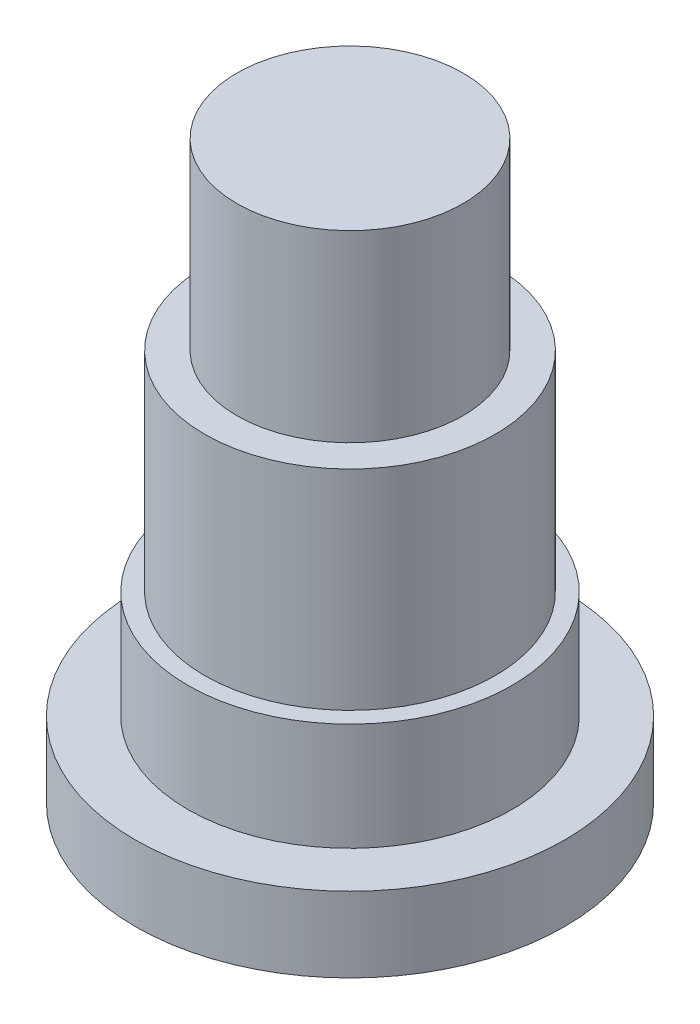
ISO-10303-21;
HEADER;
FILE_DESCRIPTION(('STEP AP214'),'2;1');
FILE_NAME('part.step','',(''),(''),'','','');
FILE_SCHEMA(('AUTOMOTIVE_DESIGN { 1 0 10303 214 1 1 1 1 }'));
ENDSEC;
DATA;
#1=APPLICATION_CONTEXT('core data for automotive mechanical design processes');
#2=APPLICATION_PROTOCOL_DEFINITION('international standard','automotive_design',2000,#1);
#3=PRODUCT_CONTEXT('',#1,'mechanical');
#4=PRODUCT('Part','Part','',(#3));
#5=PRODUCT_RELATED_PRODUCT_CATEGORY('part','',(#4));
#6=PRODUCT_DEFINITION_FORMATION('','',#4);
#7=PRODUCT_DEFINITION_CONTEXT('part definition',#1,'design');
#8=PRODUCT_DEFINITION('design','',#6,#7);
#9=PRODUCT_DEFINITION_SHAPE('','',#8);
#10=(LENGTH_UNIT() NAMED_UNIT(*) SI_UNIT(.MILLI.,.METRE.));
#11=(NAMED_UNIT(*) PLANE_ANGLE_UNIT() SI_UNIT($,.RADIAN.));
#12=(NAMED_UNIT(*) SI_UNIT($,.STERADIAN.) SOLID_ANGLE_UNIT());
#13=UNCERTAINTY_MEASURE_WITH_UNIT(LENGTH_MEASURE(1.E-05),#10,'distance_accuracy_value','');
#14=(GEOMETRIC_REPRESENTATION_CONTEXT(3) GLOBAL_UNCERTAINTY_ASSIGNED_CONTEXT((#13)) GLOBAL_UNIT_ASSIGNED_CONTEXT((#10,
#11,#12)) REPRESENTATION_CONTEXT('',''));
#15=CARTESIAN_POINT('',(0.,0.,0.));
#16=DIRECTION('',(0.,0.,1.));
#17=DIRECTION('',(1.,0.,0.));
#18=AXIS2_PLACEMENT_3D('',#15,#16,#17);
#19=CARTESIAN_POINT('',(0.,0.,0.));
#20=DIRECTION('',(0.,1.,0.));
#21=DIRECTION('',(0.,0.,1.));
#22=AXIS2_PLACEMENT_3D('',#19,#20,#21);
#23=PLANE('',#22);
#24=CARTESIAN_POINT('',(0.,0.,0.));
#25=DIRECTION('',(0.,1.,0.));
#26=DIRECTION('',(0.,0.,1.));
#27=AXIS2_PLACEMENT_3D('',#24,#25,#26);
#28=CIRCLE('',#27,19.865);
#29=CARTESIAN_POINT('',(0.,0.,19.865));
#30=VERTEX_POINT('',#29);
#31=EDGE_CURVE('E10',#30,#30,#28,.T.);
#32=ORIENTED_EDGE('',*,*,#31,.F.);
#33=EDGE_LOOP('',(#32));
#34=FACE_BOUND('',#33,.T.);
#35=ADVANCED_FACE('F37',(#34),#23,.F.);
#36=CARTESIAN_POINT('',(0.,53.24,0.));
#37=DIRECTION('',(0.,1.,0.));
#38=DIRECTION('',(0.,0.,1.));
#39=AXIS2_PLACEMENT_3D('',#36,#37,#38);
#40=CYLINDRICAL_SURFACE('',#39,19.865);
#41=CARTESIAN_POINT('',(0.,6.95,0.));
#42=DIRECTION('',(0.,1.,0.));
#43=DIRECTION('',(0.,0.,1.));
#44=AXIS2_PLACEMENT_3D('',#41,#42,#43);
#45=CIRCLE('',#44,19.865);
#46=CARTESIAN_POINT('',(0.,6.95,19.865));
#47=VERTEX_POINT('',#46);
#48=EDGE_CURVE('E44',#47,#47,#45,.T.);
#49=ORIENTED_EDGE('',*,*,#48,.F.);
#50=EDGE_LOOP('',(#49));
#51=FACE_BOUND('',#50,.T.);
#52=ORIENTED_EDGE('',*,*,#31,.T.);
#53=EDGE_LOOP('',(#52));
#54=FACE_BOUND('',#53,.T.);
#55=ADVANCED_FACE('F111',(#51,#54),#40,.T.);
#56=CARTESIAN_POINT('',(19.865,6.95,0.));
#57=DIRECTION('',(0.,-1.,0.));
#58=DIRECTION('',(0.,0.,-1.));
#59=AXIS2_PLACEMENT_3D('',#56,#57,#58);
#60=PLANE('',#59);
#61=CARTESIAN_POINT('',(0.,6.95,0.));
#62=DIRECTION('',(0.,1.,0.));
#63=DIRECTION('',(0.,0.,1.));
#64=AXIS2_PLACEMENT_3D('',#61,#62,#63);
#65=CIRCLE('',#64,15.);
#66=CARTESIAN_POINT('',(0.,6.95,15.));
#67=VERTEX_POINT('',#66);
#68=EDGE_CURVE('E49',#67,#67,#65,.T.);
#69=ORIENTED_EDGE('',*,*,#68,.F.);
#70=EDGE_LOOP('',(#69));
#71=FACE_BOUND('',#70,.T.);
#72=ORIENTED_EDGE('',*,*,#48,.T.);
#73=EDGE_LOOP('',(#72));
#74=FACE_BOUND('',#73,.T.);
#75=ADVANCED_FACE('F106',(#71,#74),#60,.F.);
#76=CARTESIAN_POINT('',(0.,53.24,0.));
#77=DIRECTION('',(0.,1.,0.));
#78=DIRECTION('',(0.,0.,1.));
#79=AXIS2_PLACEMENT_3D('',#76,#77,#78);
#80=CYLINDRICAL_SURFACE('',#79,15.);
#81=CARTESIAN_POINT('',(0.,16.9,0.));
#82=DIRECTION('',(0.,1.,0.));
#83=DIRECTION('',(0.,0.,1.));
#84=AXIS2_PLACEMENT_3D('',#81,#82,#83);
#85=CIRCLE('',#84,15.);
#86=CARTESIAN_POINT('',(0.,16.9,15.));
#87=VERTEX_POINT('',#86);
#88=EDGE_CURVE('E54',#87,#87,#85,.T.);
#89=ORIENTED_EDGE('',*,*,#88,.F.);
#90=EDGE_LOOP('',(#89));
#91=FACE_BOUND('',#90,.T.);
#92=ORIENTED_EDGE('',*,*,#68,.T.);
#93=EDGE_LOOP('',(#92));
#94=FACE_BOUND('',#93,.T.);
#95=ADVANCED_FACE('F100',(#91,#94),#80,.T.);
#96=CARTESIAN_POINT('',(15.,16.9,0.));
#97=DIRECTION('',(0.,-1.,0.));
#98=DIRECTION('',(0.,0.,-1.));
#99=AXIS2_PLACEMENT_3D('',#96,#97,#98);
#100=PLANE('',#99);
#101=CARTESIAN_POINT('',(0.,16.9,0.));
#102=DIRECTION('',(0.,1.,0.));
#103=DIRECTION('',(0.,0.,1.));
#104=AXIS2_PLACEMENT_3D('',#101,#102,#103);
#105=CIRCLE('',#104,13.44);
#106=CARTESIAN_POINT('',(0.,16.9,13.44));
#107=VERTEX_POINT('',#106);
#108=EDGE_CURVE('E60',#107,#107,#105,.T.);
#109=ORIENTED_EDGE('',*,*,#108,.F.);
#110=EDGE_LOOP('',(#109));
#111=FACE_BOUND('',#110,.T.);
#112=ORIENTED_EDGE('',*,*,#88,.T.);
#113=EDGE_LOOP('',(#112));
#114=FACE_BOUND('',#113,.T.);
#115=ADVANCED_FACE('F94',(#111,#114),#100,.F.);
#116=CARTESIAN_POINT('',(0.,53.24,0.));
#117=DIRECTION('',(0.,1.,0.));
#118=DIRECTION('',(0.,0.,1.));
#119=AXIS2_PLACEMENT_3D('',#116,#117,#118);
#120=CYLINDRICAL_SURFACE('',#119,13.44);
#121=CARTESIAN_POINT('',(0.,36.24,0.));
#122=DIRECTION('',(0.,1.,0.));
#123=DIRECTION('',(0.,0.,1.));
#124=AXIS2_PLACEMENT_3D('',#121,#122,#123);
#125=CIRCLE('',#124,13.44);
#126=CARTESIAN_POINT('',(0.,36.24,13.44));
#127=VERTEX_POINT('',#126);
#128=EDGE_CURVE('E64',#127,#127,#125,.T.);
#129=ORIENTED_EDGE('',*,*,#128,.F.);
#130=EDGE_LOOP('',(#129));
#131=FACE_BOUND('',#130,.T.);
#132=ORIENTED_EDGE('',*,*,#108,.T.);
#133=EDGE_LOOP('',(#132));
#134=FACE_BOUND('',#133,.T.);
#135=ADVANCED_FACE('F88',(#131,#134),#120,.T.);
#136=CARTESIAN_POINT('',(13.44,36.24,0.));
#137=DIRECTION('',(0.,-1.,0.));
#138=DIRECTION('',(0.,0.,-1.));
#139=AXIS2_PLACEMENT_3D('',#136,#137,#138);
#140=PLANE('',#139);
#141=CARTESIAN_POINT('',(0.,36.24,0.));
#142=DIRECTION('',(0.,1.,0.));
#143=DIRECTION('',(0.,0.,1.));
#144=AXIS2_PLACEMENT_3D('',#141,#142,#143);
#145=CIRCLE('',#144,10.465);
#146=CARTESIAN_POINT('',(0.,36.24,10.465));
#147=VERTEX_POINT('',#146);
#148=EDGE_CURVE('E68',#147,#147,#145,.T.);
#149=ORIENTED_EDGE('',*,*,#148,.F.);
#150=EDGE_LOOP('',(#149));
#151=FACE_BOUND('',#150,.T.);
#152=ORIENTED_EDGE('',*,*,#128,.T.);
#153=EDGE_LOOP('',(#152));
#154=FACE_BOUND('',#153,.T.);
#155=ADVANCED_FACE('F82',(#151,#154),#140,.F.);
#156=CARTESIAN_POINT('',(0.,53.24,0.));
#157=DIRECTION('',(0.,1.,0.));
#158=DIRECTION('',(0.,0.,1.));
#159=AXIS2_PLACEMENT_3D('',#156,#157,#158);
#160=CYLINDRICAL_SURFACE('',#159,10.465);
#161=CARTESIAN_POINT('',(0.,53.24,0.));
#162=DIRECTION('',(0.,1.,0.));
#163=DIRECTION('',(0.,0.,1.));
#164=AXIS2_PLACEMENT_3D('',#161,#162,#163);
#165=CIRCLE('',#164,10.465);
#166=CARTESIAN_POINT('',(0.,53.24,10.465));
#167=VERTEX_POINT('',#166);
#168=EDGE_CURVE('E72',#167,#167,#165,.T.);
#169=ORIENTED_EDGE('',*,*,#168,.F.);
#170=EDGE_LOOP('',(#169));
#171=FACE_BOUND('',#170,.T.);
#172=ORIENTED_EDGE('',*,*,#148,.T.);
#173=EDGE_LOOP('',(#172));
#174=FACE_BOUND('',#173,.T.);
#175=ADVANCED_FACE('F79',(#171,#174),#160,.T.);
#176=CARTESIAN_POINT('',(10.465,53.24,0.));
#177=DIRECTION('',(0.,-1.,0.));
#178=DIRECTION('',(0.,0.,-1.));
#179=AXIS2_PLACEMENT_3D('',#176,#177,#178);
#180=PLANE('',#179);
#181=ORIENTED_EDGE('',*,*,#168,.T.);
#182=EDGE_LOOP('',(#181));
#183=FACE_BOUND('',#182,.T.);
#184=ADVANCED_FACE('F77',(#183),#180,.F.);
#185=CLOSED_SHELL('',(#35,#55,#75,#95,#115,#135,#155,#175,#184));
#186=MANIFOLD_SOLID_BREP('B2',#185);
#187=ADVANCED_BREP_SHAPE_REPRESENTATION('',(#18,#186),#14);
#188=SHAPE_DEFINITION_REPRESENTATION(#9,#187);
ENDSEC;
END-ISO-10303-21;
